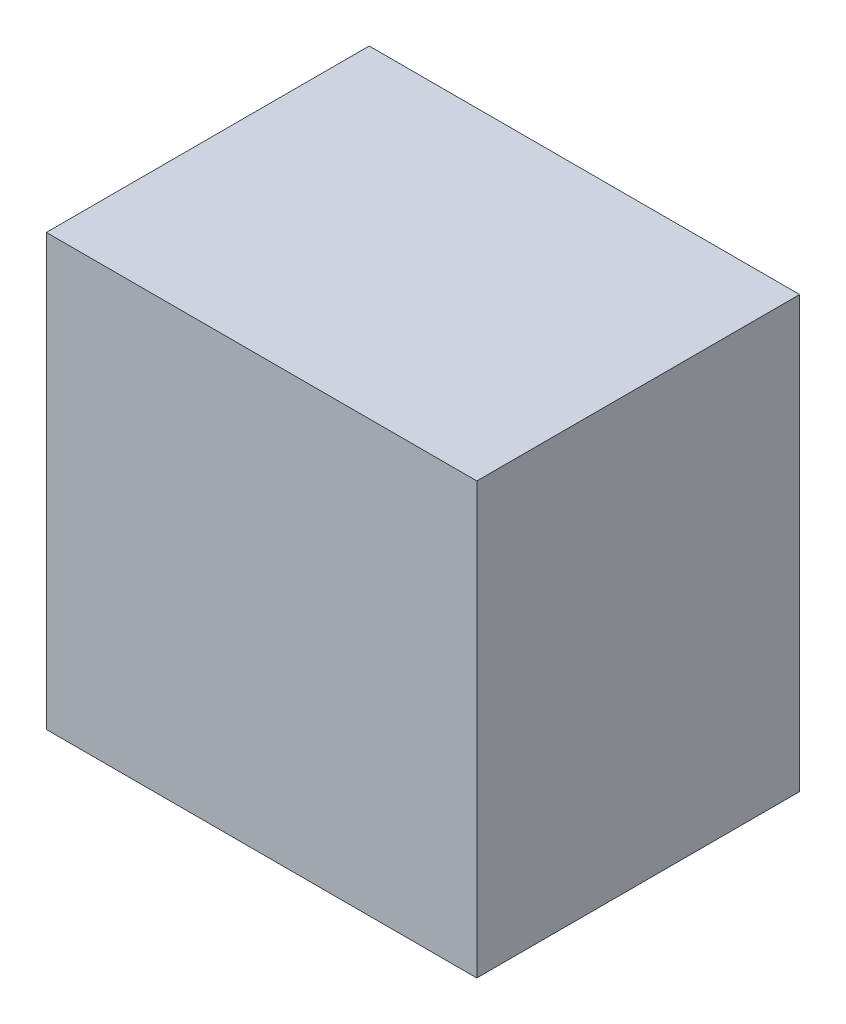
ISO-10303-21;
HEADER;
FILE_DESCRIPTION(('STEP AP214'),'2;1');
FILE_NAME('part.step','',(''),(''),'','','');
FILE_SCHEMA(('AUTOMOTIVE_DESIGN { 1 0 10303 214 1 1 1 1 }'));
ENDSEC;
DATA;
#1=APPLICATION_CONTEXT('core data for automotive mechanical design processes');
#2=APPLICATION_PROTOCOL_DEFINITION('international standard','automotive_design',2000,#1);
#3=PRODUCT_CONTEXT('',#1,'mechanical');
#4=PRODUCT('Part','Part','',(#3));
#5=PRODUCT_RELATED_PRODUCT_CATEGORY('part','',(#4));
#6=PRODUCT_DEFINITION_FORMATION('','',#4);
#7=PRODUCT_DEFINITION_CONTEXT('part definition',#1,'design');
#8=PRODUCT_DEFINITION('design','',#6,#7);
#9=PRODUCT_DEFINITION_SHAPE('','',#8);
#10=(LENGTH_UNIT() NAMED_UNIT(*) SI_UNIT(.MILLI.,.METRE.));
#11=(NAMED_UNIT(*) PLANE_ANGLE_UNIT() SI_UNIT($,.RADIAN.));
#12=(NAMED_UNIT(*) SI_UNIT($,.STERADIAN.) SOLID_ANGLE_UNIT());
#13=UNCERTAINTY_MEASURE_WITH_UNIT(LENGTH_MEASURE(1.E-05),#10,'distance_accuracy_value','');
#14=(GEOMETRIC_REPRESENTATION_CONTEXT(3) GLOBAL_UNCERTAINTY_ASSIGNED_CONTEXT((#13)) GLOBAL_UNIT_ASSIGNED_CONTEXT((#10,
#11,#12)) REPRESENTATION_CONTEXT('',''));
#15=CARTESIAN_POINT('',(0.,0.,0.));
#16=DIRECTION('',(0.,0.,1.));
#17=DIRECTION('',(1.,0.,0.));
#18=AXIS2_PLACEMENT_3D('',#15,#16,#17);
#19=CARTESIAN_POINT('',(-20.,40.,-15.));
#20=DIRECTION('',(1.,0.,0.));
#21=DIRECTION('',(0.,0.,-1.));
#22=AXIS2_PLACEMENT_3D('',#19,#20,#21);
#23=PLANE('',#22);
#24=DIRECTION('',(0.,0.,1.));
#25=VECTOR('',#24,1.);
#26=CARTESIAN_POINT('',(-20.,0.,-15.));
#27=LINE('',#26,#25);
#28=CARTESIAN_POINT('',(-20.,0.,-15.));
#29=VERTEX_POINT('',#28);
#30=CARTESIAN_POINT('',(-20.,0.,15.));
#31=VERTEX_POINT('',#30);
#32=EDGE_CURVE('E102',#29,#31,#27,.T.);
#33=ORIENTED_EDGE('',*,*,#32,.T.);
#34=DIRECTION('',(0.,-1.,0.));
#35=VECTOR('',#34,1.);
#36=CARTESIAN_POINT('',(-20.,40.,15.));
#37=LINE('',#36,#35);
#38=CARTESIAN_POINT('',(-20.,40.,15.));
#39=VERTEX_POINT('',#38);
#40=EDGE_CURVE('E11',#39,#31,#37,.T.);
#41=ORIENTED_EDGE('',*,*,#40,.F.);
#42=DIRECTION('',(0.,0.,1.));
#43=VECTOR('',#42,1.);
#44=CARTESIAN_POINT('',(-20.,40.,-15.));
#45=LINE('',#44,#43);
#46=CARTESIAN_POINT('',(-20.,40.,-15.));
#47=VERTEX_POINT('',#46);
#48=EDGE_CURVE('E90',#47,#39,#45,.T.);
#49=ORIENTED_EDGE('',*,*,#48,.F.);
#50=DIRECTION('',(0.,-1.,0.));
#51=VECTOR('',#50,1.);
#52=CARTESIAN_POINT('',(-20.,40.,-15.));
#53=LINE('',#52,#51);
#54=EDGE_CURVE('E98',#47,#29,#53,.T.);
#55=ORIENTED_EDGE('',*,*,#54,.T.);
#56=EDGE_LOOP('',(#33,#41,#49,#55));
#57=FACE_BOUND('',#56,.T.);
#58=ADVANCED_FACE('F39',(#57),#23,.F.);
#59=CARTESIAN_POINT('',(-20.,40.,15.));
#60=DIRECTION('',(0.,0.,-1.));
#61=DIRECTION('',(-1.,0.,0.));
#62=AXIS2_PLACEMENT_3D('',#59,#60,#61);
#63=PLANE('',#62);
#64=DIRECTION('',(1.,0.,0.));
#65=VECTOR('',#64,1.);
#66=CARTESIAN_POINT('',(-20.,0.,15.));
#67=LINE('',#66,#65);
#68=CARTESIAN_POINT('',(20.,0.,15.));
#69=VERTEX_POINT('',#68);
#70=EDGE_CURVE('E94',#31,#69,#67,.T.);
#71=ORIENTED_EDGE('',*,*,#70,.T.);
#72=DIRECTION('',(0.,-1.,0.));
#73=VECTOR('',#72,1.);
#74=CARTESIAN_POINT('',(20.,40.,15.));
#75=LINE('',#74,#73);
#76=CARTESIAN_POINT('',(20.,40.,15.));
#77=VERTEX_POINT('',#76);
#78=EDGE_CURVE('E47',#77,#69,#75,.T.);
#79=ORIENTED_EDGE('',*,*,#78,.F.);
#80=DIRECTION('',(1.,0.,0.));
#81=VECTOR('',#80,1.);
#82=CARTESIAN_POINT('',(-20.,40.,15.));
#83=LINE('',#82,#81);
#84=EDGE_CURVE('E85',#39,#77,#83,.T.);
#85=ORIENTED_EDGE('',*,*,#84,.F.);
#86=ORIENTED_EDGE('',*,*,#40,.T.);
#87=EDGE_LOOP('',(#71,#79,#85,#86));
#88=FACE_BOUND('',#87,.T.);
#89=ADVANCED_FACE('F93',(#88),#63,.F.);
#90=CARTESIAN_POINT('',(20.,40.,15.));
#91=DIRECTION('',(-1.,0.,0.));
#92=DIRECTION('',(0.,0.,1.));
#93=AXIS2_PLACEMENT_3D('',#90,#91,#92);
#94=PLANE('',#93);
#95=DIRECTION('',(0.,0.,-1.));
#96=VECTOR('',#95,1.);
#97=CARTESIAN_POINT('',(20.,0.,15.));
#98=LINE('',#97,#96);
#99=CARTESIAN_POINT('',(20.,0.,-15.));
#100=VERTEX_POINT('',#99);
#101=EDGE_CURVE('E72',#69,#100,#98,.T.);
#102=ORIENTED_EDGE('',*,*,#101,.T.);
#103=DIRECTION('',(0.,-1.,0.));
#104=VECTOR('',#103,1.);
#105=CARTESIAN_POINT('',(20.,40.,-15.));
#106=LINE('',#105,#104);
#107=CARTESIAN_POINT('',(20.,40.,-15.));
#108=VERTEX_POINT('',#107);
#109=EDGE_CURVE('E95',#108,#100,#106,.T.);
#110=ORIENTED_EDGE('',*,*,#109,.F.);
#111=DIRECTION('',(0.,0.,-1.));
#112=VECTOR('',#111,1.);
#113=CARTESIAN_POINT('',(20.,40.,15.));
#114=LINE('',#113,#112);
#115=EDGE_CURVE('E88',#77,#108,#114,.T.);
#116=ORIENTED_EDGE('',*,*,#115,.F.);
#117=ORIENTED_EDGE('',*,*,#78,.T.);
#118=EDGE_LOOP('',(#102,#110,#116,#117));
#119=FACE_BOUND('',#118,.T.);
#120=ADVANCED_FACE('F96',(#119),#94,.F.);
#121=CARTESIAN_POINT('',(20.,40.,-15.));
#122=DIRECTION('',(0.,0.,1.));
#123=DIRECTION('',(1.,0.,0.));
#124=AXIS2_PLACEMENT_3D('',#121,#122,#123);
#125=PLANE('',#124);
#126=DIRECTION('',(-1.,0.,0.));
#127=VECTOR('',#126,1.);
#128=CARTESIAN_POINT('',(20.,0.,-15.));
#129=LINE('',#128,#127);
#130=EDGE_CURVE('E78',#100,#29,#129,.T.);
#131=ORIENTED_EDGE('',*,*,#130,.T.);
#132=ORIENTED_EDGE('',*,*,#54,.F.);
#133=DIRECTION('',(-1.,0.,0.));
#134=VECTOR('',#133,1.);
#135=CARTESIAN_POINT('',(20.,40.,-15.));
#136=LINE('',#135,#134);
#137=EDGE_CURVE('E55',#108,#47,#136,.T.);
#138=ORIENTED_EDGE('',*,*,#137,.F.);
#139=ORIENTED_EDGE('',*,*,#109,.T.);
#140=EDGE_LOOP('',(#131,#132,#138,#139));
#141=FACE_BOUND('',#140,.T.);
#142=ADVANCED_FACE('F109',(#141),#125,.F.);
#143=CARTESIAN_POINT('',(0.,40.,0.));
#144=DIRECTION('',(0.,1.,0.));
#145=DIRECTION('',(0.,0.,1.));
#146=AXIS2_PLACEMENT_3D('',#143,#144,#145);
#147=PLANE('',#146);
#148=ORIENTED_EDGE('',*,*,#48,.T.);
#149=ORIENTED_EDGE('',*,*,#84,.T.);
#150=ORIENTED_EDGE('',*,*,#115,.T.);
#151=ORIENTED_EDGE('',*,*,#137,.T.);
#152=EDGE_LOOP('',(#148,#149,#150,#151));
#153=FACE_BOUND('',#152,.T.);
#154=ADVANCED_FACE('F86',(#153),#147,.T.);
#155=CARTESIAN_POINT('',(0.,0.,0.));
#156=DIRECTION('',(0.,1.,0.));
#157=DIRECTION('',(0.,0.,1.));
#158=AXIS2_PLACEMENT_3D('',#155,#156,#157);
#159=PLANE('',#158);
#160=ORIENTED_EDGE('',*,*,#32,.F.);
#161=ORIENTED_EDGE('',*,*,#130,.F.);
#162=ORIENTED_EDGE('',*,*,#101,.F.);
#163=ORIENTED_EDGE('',*,*,#70,.F.);
#164=EDGE_LOOP('',(#160,#161,#162,#163));
#165=FACE_BOUND('',#164,.T.);
#166=ADVANCED_FACE('F112',(#165),#159,.F.);
#167=CLOSED_SHELL('',(#58,#89,#120,#142,#154,#166));
#168=MANIFOLD_SOLID_BREP('B2',#167);
#169=ADVANCED_BREP_SHAPE_REPRESENTATION('',(#18,#168),#14);
#170=SHAPE_DEFINITION_REPRESENTATION(#9,#169);
ENDSEC;
END-ISO-10303-21;
